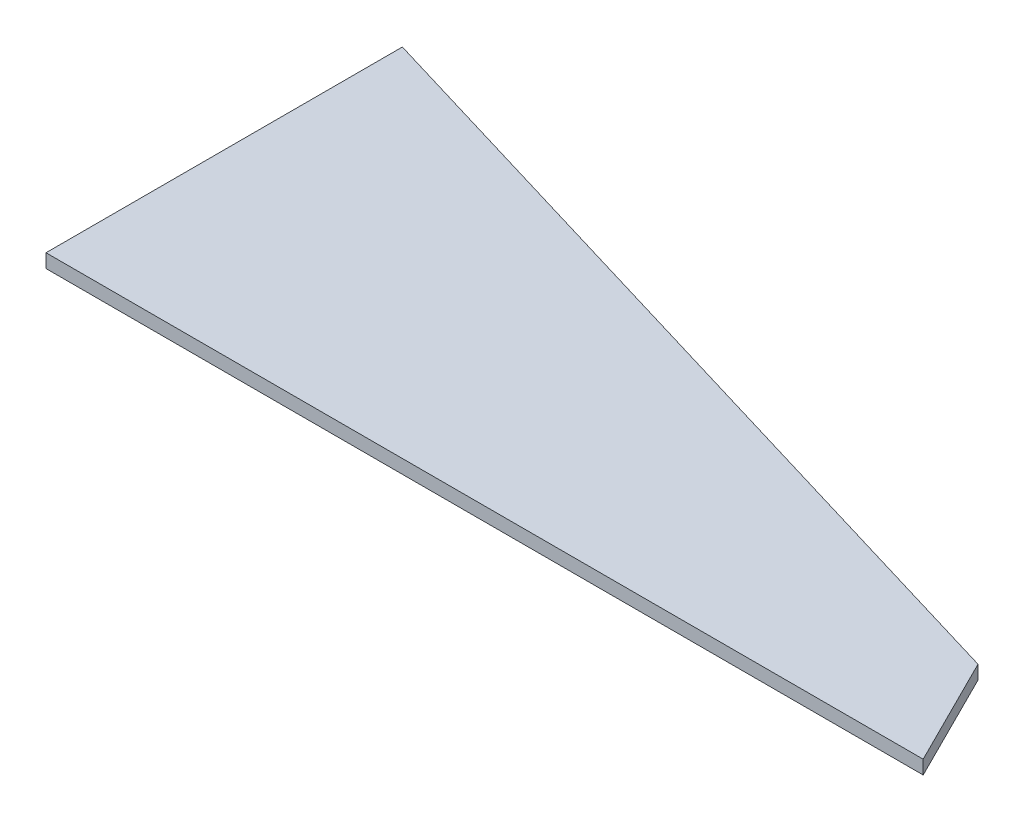
ISO-10303-21;
HEADER;
FILE_DESCRIPTION(('STEP AP214'),'2;1');
FILE_NAME('part.step','',(''),(''),'','','');
FILE_SCHEMA(('AUTOMOTIVE_DESIGN { 1 0 10303 214 1 1 1 1 }'));
ENDSEC;
DATA;
#1=APPLICATION_CONTEXT('core data for automotive mechanical design processes');
#2=APPLICATION_PROTOCOL_DEFINITION('international standard','automotive_design',2000,#1);
#3=PRODUCT_CONTEXT('',#1,'mechanical');
#4=PRODUCT('Part','Part','',(#3));
#5=PRODUCT_RELATED_PRODUCT_CATEGORY('part','',(#4));
#6=PRODUCT_DEFINITION_FORMATION('','',#4);
#7=PRODUCT_DEFINITION_CONTEXT('part definition',#1,'design');
#8=PRODUCT_DEFINITION('design','',#6,#7);
#9=PRODUCT_DEFINITION_SHAPE('','',#8);
#10=(LENGTH_UNIT() NAMED_UNIT(*) SI_UNIT(.MILLI.,.METRE.));
#11=(NAMED_UNIT(*) PLANE_ANGLE_UNIT() SI_UNIT($,.RADIAN.));
#12=(NAMED_UNIT(*) SI_UNIT($,.STERADIAN.) SOLID_ANGLE_UNIT());
#13=UNCERTAINTY_MEASURE_WITH_UNIT(LENGTH_MEASURE(1.E-05),#10,'distance_accuracy_value','');
#14=(GEOMETRIC_REPRESENTATION_CONTEXT(3) GLOBAL_UNCERTAINTY_ASSIGNED_CONTEXT((#13)) GLOBAL_UNIT_ASSIGNED_CONTEXT((#10,
#11,#12)) REPRESENTATION_CONTEXT('',''));
#15=CARTESIAN_POINT('',(0.,0.,0.));
#16=DIRECTION('',(0.,0.,1.));
#17=DIRECTION('',(1.,0.,0.));
#18=AXIS2_PLACEMENT_3D('',#15,#16,#17);
#19=CARTESIAN_POINT('',(-22.4,0.5,13.));
#20=DIRECTION('',(1.,0.,0.));
#21=DIRECTION('',(0.,0.,-1.));
#22=AXIS2_PLACEMENT_3D('',#19,#20,#21);
#23=PLANE('',#22);
#24=DIRECTION('',(0.,0.,1.));
#25=VECTOR('',#24,1.);
#26=CARTESIAN_POINT('',(-22.4,0.,13.));
#27=LINE('',#26,#25);
#28=CARTESIAN_POINT('',(-22.4,0.,0.));
#29=VERTEX_POINT('',#28);
#30=CARTESIAN_POINT('',(-22.4,0.,13.));
#31=VERTEX_POINT('',#30);
#32=EDGE_CURVE('E101',#29,#31,#27,.T.);
#33=ORIENTED_EDGE('',*,*,#32,.T.);
#34=DIRECTION('',(0.,-1.,0.));
#35=VECTOR('',#34,1.);
#36=CARTESIAN_POINT('',(-22.4,0.5,13.));
#37=LINE('',#36,#35);
#38=CARTESIAN_POINT('',(-22.4,0.5,13.));
#39=VERTEX_POINT('',#38);
#40=EDGE_CURVE('E11',#39,#31,#37,.T.);
#41=ORIENTED_EDGE('',*,*,#40,.F.);
#42=DIRECTION('',(0.,0.,1.));
#43=VECTOR('',#42,1.);
#44=CARTESIAN_POINT('',(-22.4,0.5,13.));
#45=LINE('',#44,#43);
#46=CARTESIAN_POINT('',(-22.4,0.5,0.));
#47=VERTEX_POINT('',#46);
#48=EDGE_CURVE('E89',#47,#39,#45,.T.);
#49=ORIENTED_EDGE('',*,*,#48,.F.);
#50=DIRECTION('',(0.,-1.,0.));
#51=VECTOR('',#50,1.);
#52=CARTESIAN_POINT('',(-22.4,0.5,0.));
#53=LINE('',#52,#51);
#54=EDGE_CURVE('E97',#47,#29,#53,.T.);
#55=ORIENTED_EDGE('',*,*,#54,.T.);
#56=EDGE_LOOP('',(#33,#41,#49,#55));
#57=FACE_BOUND('',#56,.T.);
#58=ADVANCED_FACE('F38',(#57),#23,.F.);
#59=CARTESIAN_POINT('',(-22.4,0.5,13.));
#60=DIRECTION('',(0.,0.,-1.));
#61=DIRECTION('',(-1.,0.,0.));
#62=AXIS2_PLACEMENT_3D('',#59,#60,#61);
#63=PLANE('',#62);
#64=DIRECTION('',(1.,0.,0.));
#65=VECTOR('',#64,1.);
#66=CARTESIAN_POINT('',(-22.4,0.,13.));
#67=LINE('',#66,#65);
#68=CARTESIAN_POINT('',(9.60000000000002,0.,13.));
#69=VERTEX_POINT('',#68);
#70=EDGE_CURVE('E93',#31,#69,#67,.T.);
#71=ORIENTED_EDGE('',*,*,#70,.T.);
#72=DIRECTION('',(0.,-1.,0.));
#73=VECTOR('',#72,1.);
#74=CARTESIAN_POINT('',(9.60000000000002,0.5,13.));
#75=LINE('',#74,#73);
#76=CARTESIAN_POINT('',(9.60000000000002,0.5,13.));
#77=VERTEX_POINT('',#76);
#78=EDGE_CURVE('E46',#77,#69,#75,.T.);
#79=ORIENTED_EDGE('',*,*,#78,.F.);
#80=DIRECTION('',(1.,0.,0.));
#81=VECTOR('',#80,1.);
#82=CARTESIAN_POINT('',(-22.4,0.5,13.));
#83=LINE('',#82,#81);
#84=EDGE_CURVE('E84',#39,#77,#83,.T.);
#85=ORIENTED_EDGE('',*,*,#84,.F.);
#86=ORIENTED_EDGE('',*,*,#40,.T.);
#87=EDGE_LOOP('',(#71,#79,#85,#86));
#88=FACE_BOUND('',#87,.T.);
#89=ADVANCED_FACE('F92',(#88),#63,.F.);
#90=CARTESIAN_POINT('',(7.60000000000002,0.5,9.));
#91=DIRECTION('',(-0.894427190999916,0.,0.447213595499958));
#92=DIRECTION('',(0.447213595499958,0.,0.894427190999916));
#93=AXIS2_PLACEMENT_3D('',#90,#91,#92);
#94=PLANE('',#93);
#95=DIRECTION('',(-0.447213595499958,0.,-0.894427190999916));
#96=VECTOR('',#95,1.);
#97=CARTESIAN_POINT('',(7.60000000000002,0.,9.));
#98=LINE('',#97,#96);
#99=CARTESIAN_POINT('',(7.60000000000002,0.,9.));
#100=VERTEX_POINT('',#99);
#101=EDGE_CURVE('E71',#69,#100,#98,.T.);
#102=ORIENTED_EDGE('',*,*,#101,.T.);
#103=DIRECTION('',(0.,-1.,0.));
#104=VECTOR('',#103,1.);
#105=CARTESIAN_POINT('',(7.60000000000002,0.5,9.));
#106=LINE('',#105,#104);
#107=CARTESIAN_POINT('',(7.60000000000002,0.5,9.));
#108=VERTEX_POINT('',#107);
#109=EDGE_CURVE('E94',#108,#100,#106,.T.);
#110=ORIENTED_EDGE('',*,*,#109,.F.);
#111=DIRECTION('',(-0.447213595499958,0.,-0.894427190999916));
#112=VECTOR('',#111,1.);
#113=CARTESIAN_POINT('',(7.60000000000002,0.5,9.));
#114=LINE('',#113,#112);
#115=EDGE_CURVE('E87',#77,#108,#114,.T.);
#116=ORIENTED_EDGE('',*,*,#115,.F.);
#117=ORIENTED_EDGE('',*,*,#78,.T.);
#118=EDGE_LOOP('',(#102,#110,#116,#117));
#119=FACE_BOUND('',#118,.T.);
#120=ADVANCED_FACE('F95',(#119),#94,.F.);
#121=CARTESIAN_POINT('',(-22.4,0.5,0.));
#122=DIRECTION('',(-0.287347885566345,0.,0.957826285221151));
#123=DIRECTION('',(0.957826285221152,0.,0.287347885566345));
#124=AXIS2_PLACEMENT_3D('',#121,#122,#123);
#125=PLANE('',#124);
#126=DIRECTION('',(-0.957826285221152,0.,-0.287347885566345));
#127=VECTOR('',#126,1.);
#128=CARTESIAN_POINT('',(-22.4,0.,0.));
#129=LINE('',#128,#127);
#130=EDGE_CURVE('E77',#100,#29,#129,.T.);
#131=ORIENTED_EDGE('',*,*,#130,.T.);
#132=ORIENTED_EDGE('',*,*,#54,.F.);
#133=DIRECTION('',(-0.957826285221152,0.,-0.287347885566345));
#134=VECTOR('',#133,1.);
#135=CARTESIAN_POINT('',(-22.4,0.5,0.));
#136=LINE('',#135,#134);
#137=EDGE_CURVE('E54',#108,#47,#136,.T.);
#138=ORIENTED_EDGE('',*,*,#137,.F.);
#139=ORIENTED_EDGE('',*,*,#109,.T.);
#140=EDGE_LOOP('',(#131,#132,#138,#139));
#141=FACE_BOUND('',#140,.T.);
#142=ADVANCED_FACE('F108',(#141),#125,.F.);
#143=CARTESIAN_POINT('',(0.,0.5,0.));
#144=DIRECTION('',(0.,-1.,0.));
#145=DIRECTION('',(0.,0.,-1.));
#146=AXIS2_PLACEMENT_3D('',#143,#144,#145);
#147=PLANE('',#146);
#148=ORIENTED_EDGE('',*,*,#48,.T.);
#149=ORIENTED_EDGE('',*,*,#84,.T.);
#150=ORIENTED_EDGE('',*,*,#115,.T.);
#151=ORIENTED_EDGE('',*,*,#137,.T.);
#152=EDGE_LOOP('',(#148,#149,#150,#151));
#153=FACE_BOUND('',#152,.T.);
#154=ADVANCED_FACE('F85',(#153),#147,.F.);
#155=CARTESIAN_POINT('',(0.,0.,0.));
#156=DIRECTION('',(0.,-1.,0.));
#157=DIRECTION('',(0.,0.,-1.));
#158=AXIS2_PLACEMENT_3D('',#155,#156,#157);
#159=PLANE('',#158);
#160=ORIENTED_EDGE('',*,*,#32,.F.);
#161=ORIENTED_EDGE('',*,*,#130,.F.);
#162=ORIENTED_EDGE('',*,*,#101,.F.);
#163=ORIENTED_EDGE('',*,*,#70,.F.);
#164=EDGE_LOOP('',(#160,#161,#162,#163));
#165=FACE_BOUND('',#164,.T.);
#166=ADVANCED_FACE('F111',(#165),#159,.T.);
#167=CLOSED_SHELL('',(#58,#89,#120,#142,#154,#166));
#168=MANIFOLD_SOLID_BREP('B2',#167);
#169=ADVANCED_BREP_SHAPE_REPRESENTATION('',(#18,#168),#14);
#170=SHAPE_DEFINITION_REPRESENTATION(#9,#169);
ENDSEC;
END-ISO-10303-21;
